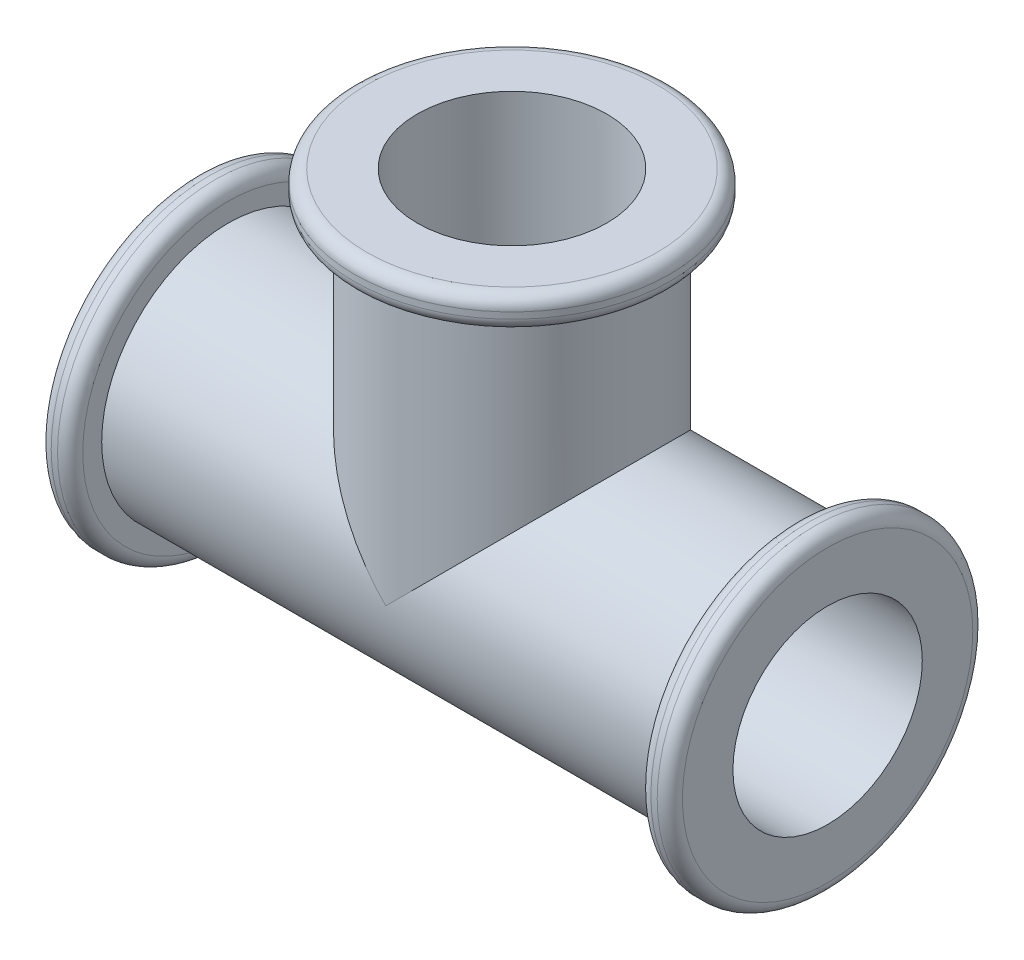
ISO-10303-21;
HEADER;
FILE_DESCRIPTION(('STEP AP214'),'2;1');
FILE_NAME('part.step','',(''),(''),'','','');
FILE_SCHEMA(('AUTOMOTIVE_DESIGN { 1 0 10303 214 1 1 1 1 }'));
ENDSEC;
DATA;
#1=APPLICATION_CONTEXT('core data for automotive mechanical design processes');
#2=APPLICATION_PROTOCOL_DEFINITION('international standard','automotive_design',2000,#1);
#3=PRODUCT_CONTEXT('',#1,'mechanical');
#4=PRODUCT('Part','Part','',(#3));
#5=PRODUCT_RELATED_PRODUCT_CATEGORY('part','',(#4));
#6=PRODUCT_DEFINITION_FORMATION('','',#4);
#7=PRODUCT_DEFINITION_CONTEXT('part definition',#1,'design');
#8=PRODUCT_DEFINITION('design','',#6,#7);
#9=PRODUCT_DEFINITION_SHAPE('','',#8);
#10=(LENGTH_UNIT() NAMED_UNIT(*) SI_UNIT(.MILLI.,.METRE.));
#11=(NAMED_UNIT(*) PLANE_ANGLE_UNIT() SI_UNIT($,.RADIAN.));
#12=(NAMED_UNIT(*) SI_UNIT($,.STERADIAN.) SOLID_ANGLE_UNIT());
#13=UNCERTAINTY_MEASURE_WITH_UNIT(LENGTH_MEASURE(1.E-05),#10,'distance_accuracy_value','');
#14=(GEOMETRIC_REPRESENTATION_CONTEXT(3) GLOBAL_UNCERTAINTY_ASSIGNED_CONTEXT((#13)) GLOBAL_UNIT_ASSIGNED_CONTEXT((#10,
#11,#12)) REPRESENTATION_CONTEXT('',''));
#15=CARTESIAN_POINT('',(0.,0.,0.));
#16=DIRECTION('',(0.,0.,1.));
#17=DIRECTION('',(1.,0.,0.));
#18=AXIS2_PLACEMENT_3D('',#15,#16,#17);
#19=CARTESIAN_POINT('',(0.,-12.502,0.));
#20=DIRECTION('',(0.,1.,0.));
#21=DIRECTION('',(0.,0.,1.));
#22=AXIS2_PLACEMENT_3D('',#19,#20,#21);
#23=CYLINDRICAL_SURFACE('',#22,10.);
#24=CARTESIAN_POINT('',(0.,0.,0.));
#25=DIRECTION('',(0.707106781186547,0.707106781186547,0.));
#26=DIRECTION('',(-0.707106781186547,0.707106781186547,0.));
#27=AXIS2_PLACEMENT_3D('',#24,#25,#26);
#28=ELLIPSE('',#27,14.1421356237309,10.);
#29=CARTESIAN_POINT('',(0.,0.,-10.));
#30=VERTEX_POINT('',#29);
#31=CARTESIAN_POINT('',(0.,0.,10.));
#32=VERTEX_POINT('',#31);
#33=EDGE_CURVE('E68',#30,#32,#28,.T.);
#34=ORIENTED_EDGE('',*,*,#33,.T.);
#35=CARTESIAN_POINT('',(0.,0.,0.));
#36=DIRECTION('',(-0.707106781186547,0.707106781186547,0.));
#37=DIRECTION('',(0.707106781186547,0.707106781186547,0.));
#38=AXIS2_PLACEMENT_3D('',#35,#36,#37);
#39=ELLIPSE('',#38,14.1421356237309,10.);
#40=EDGE_CURVE('E66',#32,#30,#39,.T.);
#41=ORIENTED_EDGE('',*,*,#40,.T.);
#42=EDGE_LOOP('',(#34,#41));
#43=FACE_BOUND('',#42,.T.);
#44=CARTESIAN_POINT('',(0.,22.5,0.));
#45=DIRECTION('',(0.,1.,0.));
#46=DIRECTION('',(0.,0.,1.));
#47=AXIS2_PLACEMENT_3D('',#44,#45,#46);
#48=CIRCLE('',#47,10.);
#49=CARTESIAN_POINT('',(0.,22.5,10.));
#50=VERTEX_POINT('',#49);
#51=EDGE_CURVE('E77',#50,#50,#48,.F.);
#52=ORIENTED_EDGE('',*,*,#51,.T.);
#53=EDGE_LOOP('',(#52));
#54=FACE_BOUND('',#53,.T.);
#55=ADVANCED_FACE('F51',(#43,#54),#23,.T.);
#56=CARTESIAN_POINT('',(25.,0.,0.));
#57=DIRECTION('',(-1.,0.,0.));
#58=DIRECTION('',(0.,0.,1.));
#59=AXIS2_PLACEMENT_3D('',#56,#57,#58);
#60=CYLINDRICAL_SURFACE('',#59,10.);
#61=ORIENTED_EDGE('',*,*,#33,.F.);
#62=ORIENTED_EDGE('',*,*,#40,.F.);
#63=EDGE_LOOP('',(#61,#62));
#64=FACE_BOUND('',#63,.T.);
#65=CARTESIAN_POINT('',(22.5,0.,0.));
#66=DIRECTION('',(1.,0.,0.));
#67=DIRECTION('',(0.,0.,-1.));
#68=AXIS2_PLACEMENT_3D('',#65,#66,#67);
#69=CIRCLE('',#68,10.);
#70=CARTESIAN_POINT('',(22.5,0.,-10.));
#71=VERTEX_POINT('',#70);
#72=EDGE_CURVE('E88',#71,#71,#69,.T.);
#73=ORIENTED_EDGE('',*,*,#72,.F.);
#74=EDGE_LOOP('',(#73));
#75=FACE_BOUND('',#74,.T.);
#76=CARTESIAN_POINT('',(-22.5,0.,0.));
#77=DIRECTION('',(-1.,0.,0.));
#78=DIRECTION('',(0.,0.,1.));
#79=AXIS2_PLACEMENT_3D('',#76,#77,#78);
#80=CIRCLE('',#79,10.);
#81=CARTESIAN_POINT('',(-22.5,0.,10.));
#82=VERTEX_POINT('',#81);
#83=EDGE_CURVE('E89',#82,#82,#80,.T.);
#84=ORIENTED_EDGE('',*,*,#83,.F.);
#85=EDGE_LOOP('',(#84));
#86=FACE_BOUND('',#85,.T.);
#87=ADVANCED_FACE('F74',(#64,#75,#86),#60,.T.);
#88=CARTESIAN_POINT('',(22.5,0.,0.));
#89=DIRECTION('',(1.,0.,0.));
#90=DIRECTION('',(0.,0.,-1.));
#91=AXIS2_PLACEMENT_3D('',#88,#89,#90);
#92=CYLINDRICAL_SURFACE('',#91,12.5);
#93=CARTESIAN_POINT('',(23.5,0.,0.));
#94=DIRECTION('',(1.,0.,0.));
#95=DIRECTION('',(0.,0.,-1.));
#96=AXIS2_PLACEMENT_3D('',#93,#94,#95);
#97=CIRCLE('',#96,12.5);
#98=CARTESIAN_POINT('',(23.5,0.,-12.5));
#99=VERTEX_POINT('',#98);
#100=EDGE_CURVE('E213',#99,#99,#97,.T.);
#101=ORIENTED_EDGE('',*,*,#100,.T.);
#102=EDGE_LOOP('',(#101));
#103=FACE_BOUND('',#102,.T.);
#104=CARTESIAN_POINT('',(24.,0.,0.));
#105=DIRECTION('',(1.,0.,0.));
#106=DIRECTION('',(0.,0.,-1.));
#107=AXIS2_PLACEMENT_3D('',#104,#105,#106);
#108=CIRCLE('',#107,12.5);
#109=CARTESIAN_POINT('',(24.,0.,-12.5));
#110=VERTEX_POINT('',#109);
#111=EDGE_CURVE('E209',#110,#110,#108,.F.);
#112=ORIENTED_EDGE('',*,*,#111,.T.);
#113=EDGE_LOOP('',(#112));
#114=FACE_BOUND('',#113,.T.);
#115=ADVANCED_FACE('F132',(#103,#114),#92,.T.);
#116=CARTESIAN_POINT('',(22.5,0.,0.));
#117=DIRECTION('',(1.,0.,0.));
#118=DIRECTION('',(0.,0.,-1.));
#119=AXIS2_PLACEMENT_3D('',#116,#117,#118);
#120=PLANE('',#119);
#121=CARTESIAN_POINT('',(22.5,0.,0.));
#122=DIRECTION('',(1.,0.,0.));
#123=DIRECTION('',(0.,0.,-1.));
#124=AXIS2_PLACEMENT_3D('',#121,#122,#123);
#125=CIRCLE('',#124,11.5);
#126=CARTESIAN_POINT('',(22.5,0.,-11.5));
#127=VERTEX_POINT('',#126);
#128=EDGE_CURVE('E217',#127,#127,#125,.F.);
#129=ORIENTED_EDGE('',*,*,#128,.T.);
#130=EDGE_LOOP('',(#129));
#131=FACE_BOUND('',#130,.T.);
#132=ORIENTED_EDGE('',*,*,#72,.T.);
#133=EDGE_LOOP('',(#132));
#134=FACE_BOUND('',#133,.T.);
#135=ADVANCED_FACE('F129',(#131,#134),#120,.F.);
#136=CARTESIAN_POINT('',(25.,0.,0.));
#137=DIRECTION('',(1.,0.,0.));
#138=DIRECTION('',(0.,0.,-1.));
#139=AXIS2_PLACEMENT_3D('',#136,#137,#138);
#140=PLANE('',#139);
#141=CARTESIAN_POINT('',(25.,0.,0.));
#142=DIRECTION('',(1.,0.,0.));
#143=DIRECTION('',(0.,0.,-1.));
#144=AXIS2_PLACEMENT_3D('',#141,#142,#143);
#145=CIRCLE('',#144,11.5);
#146=CARTESIAN_POINT('',(25.,0.,-11.5));
#147=VERTEX_POINT('',#146);
#148=EDGE_CURVE('E60',#147,#147,#145,.T.);
#149=ORIENTED_EDGE('',*,*,#148,.T.);
#150=EDGE_LOOP('',(#149));
#151=FACE_BOUND('',#150,.T.);
#152=CARTESIAN_POINT('',(25.,0.,0.));
#153=DIRECTION('',(1.,0.,0.));
#154=DIRECTION('',(0.,0.,-1.));
#155=AXIS2_PLACEMENT_3D('',#152,#153,#154);
#156=CIRCLE('',#155,7.50000000000001);
#157=CARTESIAN_POINT('',(25.,0.,-7.50000000000001));
#158=VERTEX_POINT('',#157);
#159=EDGE_CURVE('E385',#158,#158,#156,.T.);
#160=ORIENTED_EDGE('',*,*,#159,.F.);
#161=EDGE_LOOP('',(#160));
#162=FACE_BOUND('',#161,.T.);
#163=ADVANCED_FACE('F127',(#151,#162),#140,.T.);
#164=CARTESIAN_POINT('',(-22.5,0.,0.));
#165=DIRECTION('',(-1.,0.,0.));
#166=DIRECTION('',(0.,0.,1.));
#167=AXIS2_PLACEMENT_3D('',#164,#165,#166);
#168=CYLINDRICAL_SURFACE('',#167,12.5);
#169=CARTESIAN_POINT('',(-24.,0.,0.));
#170=DIRECTION('',(1.,0.,0.));
#171=DIRECTION('',(0.,0.,-1.));
#172=AXIS2_PLACEMENT_3D('',#169,#170,#171);
#173=CIRCLE('',#172,12.5);
#174=CARTESIAN_POINT('',(-24.,0.,-12.5));
#175=VERTEX_POINT('',#174);
#176=EDGE_CURVE('E198',#175,#175,#173,.T.);
#177=ORIENTED_EDGE('',*,*,#176,.T.);
#178=EDGE_LOOP('',(#177));
#179=FACE_BOUND('',#178,.T.);
#180=CARTESIAN_POINT('',(-23.5,0.,0.));
#181=DIRECTION('',(-1.,0.,0.));
#182=DIRECTION('',(0.,0.,1.));
#183=AXIS2_PLACEMENT_3D('',#180,#181,#182);
#184=CIRCLE('',#183,12.5);
#185=CARTESIAN_POINT('',(-23.5,0.,12.5));
#186=VERTEX_POINT('',#185);
#187=EDGE_CURVE('E192',#186,#186,#184,.T.);
#188=ORIENTED_EDGE('',*,*,#187,.T.);
#189=EDGE_LOOP('',(#188));
#190=FACE_BOUND('',#189,.T.);
#191=ADVANCED_FACE('F123',(#179,#190),#168,.T.);
#192=CARTESIAN_POINT('',(-22.5,0.,0.));
#193=DIRECTION('',(-1.,0.,0.));
#194=DIRECTION('',(0.,0.,-1.));
#195=AXIS2_PLACEMENT_3D('',#192,#193,#194);
#196=PLANE('',#195);
#197=CARTESIAN_POINT('',(-22.5,0.,0.));
#198=DIRECTION('',(-1.,0.,0.));
#199=DIRECTION('',(0.,0.,1.));
#200=AXIS2_PLACEMENT_3D('',#197,#198,#199);
#201=CIRCLE('',#200,11.5);
#202=CARTESIAN_POINT('',(-22.5,0.,11.5));
#203=VERTEX_POINT('',#202);
#204=EDGE_CURVE('E205',#203,#203,#201,.F.);
#205=ORIENTED_EDGE('',*,*,#204,.T.);
#206=EDGE_LOOP('',(#205));
#207=FACE_BOUND('',#206,.T.);
#208=ORIENTED_EDGE('',*,*,#83,.T.);
#209=EDGE_LOOP('',(#208));
#210=FACE_BOUND('',#209,.T.);
#211=ADVANCED_FACE('F119',(#207,#210),#196,.F.);
#212=CARTESIAN_POINT('',(-25.,0.,0.));
#213=DIRECTION('',(1.,0.,0.));
#214=DIRECTION('',(0.,0.,-1.));
#215=AXIS2_PLACEMENT_3D('',#212,#213,#214);
#216=PLANE('',#215);
#217=CARTESIAN_POINT('',(-25.,0.,0.));
#218=DIRECTION('',(1.,0.,0.));
#219=DIRECTION('',(0.,0.,-1.));
#220=AXIS2_PLACEMENT_3D('',#217,#218,#219);
#221=CIRCLE('',#220,11.5);
#222=CARTESIAN_POINT('',(-25.,0.,-11.5));
#223=VERTEX_POINT('',#222);
#224=EDGE_CURVE('E202',#223,#223,#221,.F.);
#225=ORIENTED_EDGE('',*,*,#224,.T.);
#226=EDGE_LOOP('',(#225));
#227=FACE_BOUND('',#226,.T.);
#228=CARTESIAN_POINT('',(-25.,0.,0.));
#229=DIRECTION('',(1.,0.,0.));
#230=DIRECTION('',(0.,0.,-1.));
#231=AXIS2_PLACEMENT_3D('',#228,#229,#230);
#232=CIRCLE('',#231,7.50000000000001);
#233=CARTESIAN_POINT('',(-25.,0.,-7.50000000000001));
#234=VERTEX_POINT('',#233);
#235=EDGE_CURVE('E81',#234,#234,#232,.T.);
#236=ORIENTED_EDGE('',*,*,#235,.T.);
#237=EDGE_LOOP('',(#236));
#238=FACE_BOUND('',#237,.T.);
#239=ADVANCED_FACE('F122',(#227,#238),#216,.F.);
#240=CARTESIAN_POINT('',(0.,22.5,0.));
#241=DIRECTION('',(0.,1.,0.));
#242=DIRECTION('',(0.,0.,1.));
#243=AXIS2_PLACEMENT_3D('',#240,#241,#242);
#244=CYLINDRICAL_SURFACE('',#243,12.5);
#245=CARTESIAN_POINT('',(0.,24.,0.));
#246=DIRECTION('',(0.,1.,0.));
#247=DIRECTION('',(0.,0.,1.));
#248=AXIS2_PLACEMENT_3D('',#245,#246,#247);
#249=CIRCLE('',#248,12.5);
#250=CARTESIAN_POINT('',(0.,24.,12.5));
#251=VERTEX_POINT('',#250);
#252=EDGE_CURVE('E187',#251,#251,#249,.F.);
#253=ORIENTED_EDGE('',*,*,#252,.T.);
#254=EDGE_LOOP('',(#253));
#255=FACE_BOUND('',#254,.T.);
#256=CARTESIAN_POINT('',(0.,23.5,0.));
#257=DIRECTION('',(0.,1.,0.));
#258=DIRECTION('',(0.,0.,1.));
#259=AXIS2_PLACEMENT_3D('',#256,#257,#258);
#260=CIRCLE('',#259,12.5);
#261=CARTESIAN_POINT('',(0.,23.5,12.5));
#262=VERTEX_POINT('',#261);
#263=EDGE_CURVE('E184',#262,#262,#260,.T.);
#264=ORIENTED_EDGE('',*,*,#263,.T.);
#265=EDGE_LOOP('',(#264));
#266=FACE_BOUND('',#265,.T.);
#267=ADVANCED_FACE('F145',(#255,#266),#244,.T.);
#268=CARTESIAN_POINT('',(0.,22.5,0.));
#269=DIRECTION('',(0.,1.,0.));
#270=DIRECTION('',(0.,0.,1.));
#271=AXIS2_PLACEMENT_3D('',#268,#269,#270);
#272=PLANE('',#271);
#273=CARTESIAN_POINT('',(0.,22.5,0.));
#274=DIRECTION('',(0.,1.,0.));
#275=DIRECTION('',(0.,0.,1.));
#276=AXIS2_PLACEMENT_3D('',#273,#274,#275);
#277=CIRCLE('',#276,11.5);
#278=CARTESIAN_POINT('',(0.,22.5,11.5));
#279=VERTEX_POINT('',#278);
#280=EDGE_CURVE('E12',#279,#279,#277,.F.);
#281=ORIENTED_EDGE('',*,*,#280,.T.);
#282=EDGE_LOOP('',(#281));
#283=FACE_BOUND('',#282,.T.);
#284=ORIENTED_EDGE('',*,*,#51,.F.);
#285=EDGE_LOOP('',(#284));
#286=FACE_BOUND('',#285,.T.);
#287=ADVANCED_FACE('F150',(#283,#286),#272,.F.);
#288=CARTESIAN_POINT('',(0.,6.61437827766147,7.5));
#289=CARTESIAN_POINT('',(-0.17504274505637,6.6143819762977,7.49999838387404));
#290=CARTESIAN_POINT('',(-0.350119145702295,6.6213667833604,7.4938544531901));
#291=CARTESIAN_POINT('',(-0.698370859496996,6.64887553786825,7.46945630098661));
#292=CARTESIAN_POINT('',(-0.871545518764412,6.66940400249785,7.45119803899091));
#293=CARTESIAN_POINT('',(-1.21468926880288,6.72284656903216,7.40301431271971));
#294=CARTESIAN_POINT('',(-1.38465041251844,6.75578799539214,7.37306310366495));
#295=CARTESIAN_POINT('',(-1.71986277717137,6.8323686910377,7.30215402879712));
#296=CARTESIAN_POINT('',(-1.88511109316884,6.87601440577396,7.26118953003702));
#297=CARTESIAN_POINT('',(-2.20771561850324,6.97141228827306,7.16963772461485));
#298=CARTESIAN_POINT('',(-2.36515113857652,7.02303888080965,7.11919724072745));
#299=CARTESIAN_POINT('',(-2.67419293107733,7.13305481255116,7.00896652342575));
#300=CARTESIAN_POINT('',(-2.82579985213641,7.19144339633406,6.94917733414979));
#301=CARTESIAN_POINT('',(-3.27160873914532,7.37426489006267,6.75658060252613));
#302=CARTESIAN_POINT('',(-3.5570438840726,7.50643092066623,6.61047289700966));
#303=CARTESIAN_POINT('',(-3.99541081726528,7.72612312151328,6.35008921903902));
#304=CARTESIAN_POINT('',(-4.15615316575257,7.8106651724496,6.24603009576815));
#305=CARTESIAN_POINT('',(-4.46871903668722,7.98137144438257,6.02636084854274));
#306=CARTESIAN_POINT('',(-4.62054182383562,8.06753579834549,5.91074977439962));
#307=CARTESIAN_POINT('',(-4.91520104423277,8.23983652349764,5.66809334754194));
#308=CARTESIAN_POINT('',(-5.05802418508795,8.32597267462924,5.54103172535059));
#309=CARTESIAN_POINT('',(-5.33408445927277,8.49650996249822,5.27581060151741));
#310=CARTESIAN_POINT('',(-5.46732155596776,8.58091109260406,5.1376510574673));
#311=CARTESIAN_POINT('',(-5.7499246921732,8.76343118826713,4.8210103497897));
#312=CARTESIAN_POINT('',(-5.89701404634829,8.86082412343817,4.64006256697592));
#313=CARTESIAN_POINT('',(-6.17528183227035,9.04840053279327,4.26272756958657));
#314=CARTESIAN_POINT('',(-6.3064566859225,9.13858238414423,4.06633689924784));
#315=CARTESIAN_POINT('',(-6.55103109308801,9.30904597144164,3.65927040592032));
#316=CARTESIAN_POINT('',(-6.66446411643237,9.389346286259,3.44862258189058));
#317=CARTESIAN_POINT('',(-6.87196979125072,9.53775182569571,3.01395872397105));
#318=CARTESIAN_POINT('',(-6.9660526843648,9.60586349902812,2.78994984323821));
#319=CARTESIAN_POINT('',(-7.10776033708898,9.70920590550307,2.39977112189464));
#320=CARTESIAN_POINT('',(-7.16083762462404,9.7481569422498,2.23654263418172));
#321=CARTESIAN_POINT('',(-7.25599960853253,9.81827338648172,1.90529321507479));
#322=CARTESIAN_POINT('',(-7.2980869368163,9.84944065796967,1.73727344182394));
#323=CARTESIAN_POINT('',(-7.37068804314675,9.90335558510536,1.39753765355225));
#324=CARTESIAN_POINT('',(-7.4012095412221,9.92610885673368,1.22582418520902));
#325=CARTESIAN_POINT('',(-7.4502746855015,9.96274691067039,0.879743734183585));
#326=CARTESIAN_POINT('',(-7.46881790234558,9.97663137507731,0.705376656612369));
#327=CARTESIAN_POINT('',(-7.49366784467255,9.9952483493686,0.354821662174929));
#328=CARTESIAN_POINT('',(-7.49994237770958,9.99995678167227,0.178630171226914));
#329=CARTESIAN_POINT('',(-7.50005683113607,10.000042624962,-0.173758351306047));
#330=CARTESIAN_POINT('',(-7.49389680073092,9.99542007287206,-0.349955382866308));
#331=CARTESIAN_POINT('',(-7.46923905931901,9.97694670651412,-0.701027604628014));
#332=CARTESIAN_POINT('',(-7.45073890946883,9.96309406805562,-0.875902526623198));
#333=CARTESIAN_POINT('',(-7.4016891825028,9.92646651600951,-1.22299713100226));
#334=CARTESIAN_POINT('',(-7.37113968535831,9.90369166163854,-1.39521683100093));
#335=CARTESIAN_POINT('',(-7.2996954090771,9.85063449039492,-1.72994463123949));
#336=CARTESIAN_POINT('',(-7.259194717014,9.82063888168686,-1.89258265463912));
#337=CARTESIAN_POINT('',(-7.16789010348176,9.7533432482617,-2.21341583625951));
#338=CARTESIAN_POINT('',(-7.11708259473587,9.71604068052106,-2.37160942571489));
#339=CARTESIAN_POINT('',(-6.95006274717155,9.59413977438204,-2.83823794303704));
#340=CARTESIAN_POINT('',(-6.81920036438611,9.49950846801055,-3.13896269049413));
#341=CARTESIAN_POINT('',(-6.50734387047821,9.27804864379447,-3.74612986545195));
#342=CARTESIAN_POINT('',(-6.3224558655491,9.14884335766367,-4.0496657186402));
#343=CARTESIAN_POINT('',(-5.91631511751204,8.87301878295385,-4.62284746725909));
#344=CARTESIAN_POINT('',(-5.69503138536139,8.72638468442634,-4.89246413400518));
#345=CARTESIAN_POINT('',(-5.31581411389265,8.485042738548,-5.29480881247806));
#346=CARTESIAN_POINT('',(-5.16809085297808,8.39310925041175,-5.43905294132654));
#347=CARTESIAN_POINT('',(-4.86166142579991,8.20797296629043,-5.71460427162252));
#348=CARTESIAN_POINT('',(-4.70295314530712,8.11476992874987,-5.84590897083322));
#349=CARTESIAN_POINT('',(-4.37489703005722,7.92914991013118,-6.09530688932278));
#350=CARTESIAN_POINT('',(-4.20554361298499,7.83673337082412,-6.21339308501906));
#351=CARTESIAN_POINT('',(-3.85647449499815,7.65507530287246,-6.43587029402998));
#352=CARTESIAN_POINT('',(-3.67676112193589,7.56583306820197,-6.54026436679214));
#353=CARTESIAN_POINT('',(-3.3435305255638,7.41026277562445,-6.7155722654236));
#354=CARTESIAN_POINT('',(-3.1918373125528,7.34288681688719,-6.78902852483033));
#355=CARTESIAN_POINT('',(-2.8818286600929,7.21353507700448,-6.92631258115993));
#356=CARTESIAN_POINT('',(-2.72351115335445,7.1515610005483,-6.99013734325369));
#357=CARTESIAN_POINT('',(-2.40078106938068,7.03499498355601,-7.10743795595147));
#358=CARTESIAN_POINT('',(-2.23637992914152,6.98039000655185,-7.16093215631046));
#359=CARTESIAN_POINT('',(-1.90173398337719,6.88048971673614,-7.25697383906694));
#360=CARTESIAN_POINT('',(-1.73149346253768,6.83518774138737,-7.29952916110583));
#361=CARTESIAN_POINT('',(-1.4201065752548,6.76376361800342,-7.36568941013316));
#362=CARTESIAN_POINT('',(-1.27986564928429,6.73562014480373,-7.39137773468902));
#363=CARTESIAN_POINT('',(-0.996812114330297,6.68761574057221,-7.43484020430898));
#364=CARTESIAN_POINT('',(-0.854000818986896,6.66775069741102,-7.45261827891484));
#365=CARTESIAN_POINT('',(-0.566747802379881,6.63708025293432,-7.47994591403064));
#366=CARTESIAN_POINT('',(-0.422307669954232,6.62626668641683,-7.48950289088611));
#367=CARTESIAN_POINT('',(-0.132710912533417,6.61412778066668,-7.50022540461936));
#368=CARTESIAN_POINT('',(0.012445719814645,6.61280253900894,-7.50139085520134));
#369=CARTESIAN_POINT('',(0.302399458554398,6.61970015257382,-7.49530453133557));
#370=CARTESIAN_POINT('',(0.447196430889058,6.62792615054571,-7.4880499863645));
#371=CARTESIAN_POINT('',(0.735304347701751,6.65357632859433,-7.46526710078138));
#372=CARTESIAN_POINT('',(0.878615290476944,6.67100051921007,-7.44973875068944));
#373=CARTESIAN_POINT('',(1.16300453984837,6.71437252311565,-7.41067135494668));
#374=CARTESIAN_POINT('',(1.30407985269954,6.74033089503036,-7.38712238475188));
#375=CARTESIAN_POINT('',(1.58317138197441,6.79983969759906,-7.33238101466956));
#376=CARTESIAN_POINT('',(1.72118576102563,6.83339455960175,-7.30118415256481));
#377=CARTESIAN_POINT('',(2.04453327820463,6.92081343095282,-7.21853070164236));
#378=CARTESIAN_POINT('',(2.22826531808666,6.97758010532759,-7.16386030544521));
#379=CARTESIAN_POINT('',(2.58816900651376,7.10070244483857,-7.04184138194053));
#380=CARTESIAN_POINT('',(2.76433695078966,7.16706274021179,-6.97448672796228));
#381=CARTESIAN_POINT('',(3.10897695466769,7.30690755766541,-6.82783857722431));
#382=CARTESIAN_POINT('',(3.27743828245919,7.38040159461201,-6.74852905513665));
#383=CARTESIAN_POINT('',(3.60628224855554,7.53219738599037,-6.57867589007165));
#384=CARTESIAN_POINT('',(3.76666561469197,7.61049870586594,-6.48813326176224));
#385=CARTESIAN_POINT('',(4.08484159575621,7.77280857721973,-6.29286343156943));
#386=CARTESIAN_POINT('',(4.24234264199053,7.85692102684046,-6.1877481912395));
#387=CARTESIAN_POINT('',(4.54857908441787,8.02641315727647,-5.96625095327432));
#388=CARTESIAN_POINT('',(4.69731144936841,8.11179326368698,-5.8498650958194));
#389=CARTESIAN_POINT('',(4.9857693867153,8.28217070112482,-5.60604802897366));
#390=CARTESIAN_POINT('',(5.12549204526758,8.36716790013076,-5.47861327717322));
#391=CARTESIAN_POINT('',(5.3954907605958,8.53523072259393,-5.2129217295144));
#392=CARTESIAN_POINT('',(5.52576672233518,8.61829632661303,-5.07466482481105));
#393=CARTESIAN_POINT('',(5.80374649790019,8.79886280965527,-4.75609627857785));
#394=CARTESIAN_POINT('',(5.9490352358762,8.89555017880777,-4.57319795109074));
#395=CARTESIAN_POINT('',(6.22351369133032,9.08140583135808,-4.19202039254));
#396=CARTESIAN_POINT('',(6.35269975440163,9.17057240647706,-3.99373768658795));
#397=CARTESIAN_POINT('',(6.59309973527558,9.33871511072048,-3.58295524329398));
#398=CARTESIAN_POINT('',(6.70434399040802,9.41770839502805,-3.37048038218725));
#399=CARTESIAN_POINT('',(6.90721459476481,9.56319061215452,-2.93233430317765));
#400=CARTESIAN_POINT('',(6.99885153168538,9.62968629114609,-2.7066702914896));
#401=CARTESIAN_POINT('',(7.13594683127491,9.72986513620538,-2.31458682145055));
#402=CARTESIAN_POINT('',(7.18696832201431,9.76737290150481,-2.15106438801798));
#403=CARTESIAN_POINT('',(7.27799769396799,9.83454643934873,-1.81942149738114));
#404=CARTESIAN_POINT('',(7.31800820540457,9.8642140846164,-1.6513021488213));
#405=CARTESIAN_POINT('',(7.38645709360363,9.91510086141253,-1.31158500513156));
#406=CARTESIAN_POINT('',(7.41490355131715,9.93632589240866,-1.13998972731271));
#407=CARTESIAN_POINT('',(7.45984888136917,9.96991081706726,-0.794368064329089));
#408=CARTESIAN_POINT('',(7.47634730729937,9.98227037949355,-0.620341588576282));
#409=CARTESIAN_POINT('',(7.49716192377631,9.99786922691846,-0.270737236865624));
#410=CARTESIAN_POINT('',(7.50144922902552,10.0010868867835,-0.095156666283223));
#411=CARTESIAN_POINT('',(7.49769057486672,9.99826797422904,0.255796459899253));
#412=CARTESIAN_POINT('',(7.4896446687018,9.99223144176046,0.431169016394064));
#413=CARTESIAN_POINT('',(7.46134480780408,9.97103698632919,0.780405860087463));
#414=CARTESIAN_POINT('',(7.44108809976061,9.95587700619856,0.954269798148902));
#415=CARTESIAN_POINT('',(7.38867771478753,9.91676635381665,1.29918219505268));
#416=CARTESIAN_POINT('',(7.35652407050672,9.89281570568963,1.47023066162018));
#417=CARTESIAN_POINT('',(7.28189307709132,9.83744673781723,1.80341707766246));
#418=CARTESIAN_POINT('',(7.23974634119007,9.8062681638195,1.96566921370883));
#419=CARTESIAN_POINT('',(7.14520309294347,9.7366786515487,2.28559292852834));
#420=CARTESIAN_POINT('',(7.09280300352853,9.69826518942856,2.44326288661389));
#421=CARTESIAN_POINT('',(6.92110225774481,9.57316299030428,2.90814334154297));
#422=CARTESIAN_POINT('',(6.78724605295606,9.47657095067025,3.20746548927604));
#423=CARTESIAN_POINT('',(6.46860168175561,9.25087814998407,3.8127837237771));
#424=CARTESIAN_POINT('',(6.27976164738311,9.11933431178644,4.11569486640102));
#425=CARTESIAN_POINT('',(5.86565147799067,8.83925861197747,4.68708538623881));
#426=CARTESIAN_POINT('',(5.64034786026238,8.69071117385267,4.95553270683283));
#427=CARTESIAN_POINT('',(5.25447653158745,8.44671829342253,5.35573297787662));
#428=CARTESIAN_POINT('',(5.10414606638606,8.35384690618711,5.49915593102941));
#429=CARTESIAN_POINT('',(4.79241369482712,8.1671063077942,5.77284943140309));
#430=CARTESIAN_POINT('',(4.63100953564152,8.07323689690108,5.90311728895228));
#431=CARTESIAN_POINT('',(4.29746571429963,7.8866399911287,6.15019469285746));
#432=CARTESIAN_POINT('',(4.12532129703785,7.79391302412087,6.26699821194905));
#433=CARTESIAN_POINT('',(3.77054927179511,7.61208490038275,6.48663766052406));
#434=CARTESIAN_POINT('',(3.58792438907829,7.5229828112717,6.58947719789702));
#435=CARTESIAN_POINT('',(3.25286478435908,7.36980342890909,6.75989283434651));
#436=CARTESIAN_POINT('',(3.10243084431296,7.30447828912286,6.83028750809664));
#437=CARTESIAN_POINT('',(2.79519765738826,7.17937554694085,6.9616658727386));
#438=CARTESIAN_POINT('',(2.63839693693284,7.11959923945138,7.02264736910911));
#439=CARTESIAN_POINT('',(2.31902463270295,7.00753877029719,7.1344699800963));
#440=CARTESIAN_POINT('',(2.15646715573252,6.95523768808627,7.18533410159404));
#441=CARTESIAN_POINT('',(1.82582318644918,6.85992197126499,7.2763865291595));
#442=CARTESIAN_POINT('',(1.65773910143077,6.81690335354225,7.31657941597485));
#443=CARTESIAN_POINT('',(1.24611764988477,6.72665035308058,7.39982855789616));
#444=CARTESIAN_POINT('',(1.00008621921669,6.685011615971,7.4372125818488));
#445=CARTESIAN_POINT('',(0.627109028744517,6.64288211241111,7.47478587010325));
#446=CARTESIAN_POINT('',(0.502120598471653,6.63222701531837,7.48422651957545));
#447=CARTESIAN_POINT('',(0.251427162606856,6.61797427482255,7.49683371584342));
#448=CARTESIAN_POINT('',(0.125722262175374,6.61437562116226,7.50000116076226));
#449=CARTESIAN_POINT('',(0.,6.61437827766147,7.5));
#450=B_SPLINE_CURVE_WITH_KNOTS('',3,(#288,#289,#290,#291,#292,#293,#294,#295,#296,#297,#298,
#299,#300,#301,#302,#303,#304,#305,#306,#307,#308,#309,#310,#311,#312,#313,#314,#315,#316,#317,
#318,#319,#320,#321,#322,#323,#324,#325,#326,#327,#328,#329,#330,#331,#332,#333,#334,#335,#336,
#337,#338,#339,#340,#341,#342,#343,#344,#345,#346,#347,#348,#349,#350,#351,#352,#353,#354,#355,
#356,#357,#358,#359,#360,#361,#362,#363,#364,#365,#366,#367,#368,#369,#370,#371,#372,#373,#374,
#375,#376,#377,#378,#379,#380,#381,#382,#383,#384,#385,#386,#387,#388,#389,#390,#391,#392,#393,
#394,#395,#396,#397,#398,#399,#400,#401,#402,#403,#404,#405,#406,#407,#408,#409,#410,#411,#412,
#413,#414,#415,#416,#417,#418,#419,#420,#421,#422,#423,#424,#425,#426,#427,#428,#429,#430,#431,
#432,#433,#434,#435,#436,#437,#438,#439,#440,#441,#442,#443,#444,#445,#446,#447,#448,#449),
.UNSPECIFIED.,.T.,.F.,(4,2,2,2,2,2,2,2,2,2,2,2,2,2,2,2,2,2,2,2,2,2,2,2,2,2,2,2,2,2,2,2,2,2,2,2,
2,2,2,2,2,2,2,2,2,2,2,2,2,2,2,2,2,2,2,2,2,2,2,2,2,2,2,2,2,2,2,2,2,2,2,2,2,2,2,2,2,2,2,2,4),(0.,
0.52494665430854,1.05006848141856,1.57635306837582,2.1029553322816,2.62198622685236,
3.14095919324642,4.17811218850752,4.80566508397348,5.43326964042964,6.061780426393,
6.69029361418683,7.44738762703935,8.20465154491873,8.96046919626114,9.71588577295534,
10.2433789495487,10.7707456843026,11.2977597865321,11.8247927784671,12.3532068340179,
12.8816187985613,13.4101352269263,13.9386481475935,14.448892861373,14.9593154709263,
15.9794159816072,17.1099698820185,18.2414914205569,18.9189650138306,19.5965693614304,
20.2745320584566,20.9523430085371,21.4964710416301,22.0407701699222,22.5840934051783,
23.1270261606961,23.5625720536543,23.9979013400772,24.4328374979326,24.8677781285273,
25.3028619129807,25.7379461959414,26.1735708106619,26.609450201141,27.2082971358611,
27.8074340672286,28.4073813950994,29.0072745701219,29.6283553138709,30.2496495148833,
30.8711436522056,31.4926440410755,32.2499956478533,33.0075188193678,33.7637473732032,
34.5195665371228,35.0451096014309,35.57052701867,36.0955766408918,36.6206458792658,
37.1469561368486,37.6732641223298,38.1996908249707,38.7261160829478,39.2370944402893,
39.7482513806143,40.7698210149854,41.9071133704993,43.045456033251,43.7276445027794,
44.4099721703686,45.0926041030805,45.7750593264447,46.3100858652191,46.8452369485077,
47.3791568263482,47.9128471411508,48.6669364564278,49.044026816004,49.4210631843482),.UNSPECIFIED.);
#451=CARTESIAN_POINT('',(0.,6.61437827766147,7.5));
#452=VERTEX_POINT('',#451);
#453=EDGE_CURVE('E93',#452,#452,#450,.T.);
#454=ORIENTED_EDGE('',*,*,#453,.F.);
#455=EDGE_LOOP('',(#454));
#456=FACE_BOUND('',#455,.T.);
#457=ADVANCED_FACE('F116',(#456),#60,.T.);
#458=CARTESIAN_POINT('',(0.,-12.502,0.));
#459=DIRECTION('',(0.,1.,0.));
#460=DIRECTION('',(0.,0.,1.));
#461=AXIS2_PLACEMENT_3D('',#458,#459,#460);
#462=CYLINDRICAL_SURFACE('',#461,7.5);
#463=CARTESIAN_POINT('',(0.,25.,0.));
#464=DIRECTION('',(0.,1.,0.));
#465=DIRECTION('',(0.,0.,1.));
#466=AXIS2_PLACEMENT_3D('',#463,#464,#465);
#467=CIRCLE('',#466,7.5);
#468=CARTESIAN_POINT('',(0.,25.,7.5));
#469=VERTEX_POINT('',#468);
#470=EDGE_CURVE('E72',#469,#469,#467,.T.);
#471=ORIENTED_EDGE('',*,*,#470,.T.);
#472=EDGE_LOOP('',(#471));
#473=FACE_BOUND('',#472,.T.);
#474=ORIENTED_EDGE('',*,*,#453,.T.);
#475=EDGE_LOOP('',(#474));
#476=FACE_BOUND('',#475,.T.);
#477=ADVANCED_FACE('F110',(#473,#476),#462,.F.);
#478=CARTESIAN_POINT('',(0.,25.,0.));
#479=DIRECTION('',(0.,1.,0.));
#480=DIRECTION('',(0.,0.,1.));
#481=AXIS2_PLACEMENT_3D('',#478,#479,#480);
#482=PLANE('',#481);
#483=CARTESIAN_POINT('',(0.,25.,0.));
#484=DIRECTION('',(0.,1.,0.));
#485=DIRECTION('',(0.,0.,1.));
#486=AXIS2_PLACEMENT_3D('',#483,#484,#485);
#487=CIRCLE('',#486,11.5);
#488=CARTESIAN_POINT('',(0.,25.,11.5));
#489=VERTEX_POINT('',#488);
#490=EDGE_CURVE('E105',#489,#489,#487,.T.);
#491=ORIENTED_EDGE('',*,*,#490,.T.);
#492=EDGE_LOOP('',(#491));
#493=FACE_BOUND('',#492,.T.);
#494=ORIENTED_EDGE('',*,*,#470,.F.);
#495=EDGE_LOOP('',(#494));
#496=FACE_BOUND('',#495,.T.);
#497=ADVANCED_FACE('F115',(#493,#496),#482,.T.);
#498=CARTESIAN_POINT('',(25.,0.,0.));
#499=DIRECTION('',(-1.,0.,0.));
#500=DIRECTION('',(0.,0.,1.));
#501=AXIS2_PLACEMENT_3D('',#498,#499,#500);
#502=CYLINDRICAL_SURFACE('',#501,7.5);
#503=ORIENTED_EDGE('',*,*,#235,.F.);
#504=EDGE_LOOP('',(#503));
#505=FACE_BOUND('',#504,.T.);
#506=ORIENTED_EDGE('',*,*,#159,.T.);
#507=EDGE_LOOP('',(#506));
#508=FACE_BOUND('',#507,.T.);
#509=ADVANCED_FACE('F137',(#505,#508),#502,.F.);
#510=CARTESIAN_POINT('',(0.,24.,0.));
#511=DIRECTION('',(0.,1.,0.));
#512=DIRECTION('',(0.,0.,1.));
#513=AXIS2_PLACEMENT_3D('',#510,#511,#512);
#514=TOROIDAL_SURFACE('',#513,11.5,1.);
#515=ORIENTED_EDGE('',*,*,#252,.F.);
#516=EDGE_LOOP('',(#515));
#517=FACE_BOUND('',#516,.T.);
#518=ORIENTED_EDGE('',*,*,#490,.F.);
#519=EDGE_LOOP('',(#518));
#520=FACE_BOUND('',#519,.T.);
#521=ADVANCED_FACE('F140',(#517,#520),#514,.T.);
#522=CARTESIAN_POINT('',(-24.,0.,0.));
#523=DIRECTION('',(1.,0.,0.));
#524=DIRECTION('',(0.,0.,-1.));
#525=AXIS2_PLACEMENT_3D('',#522,#523,#524);
#526=TOROIDAL_SURFACE('',#525,11.5,1.);
#527=ORIENTED_EDGE('',*,*,#224,.F.);
#528=EDGE_LOOP('',(#527));
#529=FACE_BOUND('',#528,.T.);
#530=ORIENTED_EDGE('',*,*,#176,.F.);
#531=EDGE_LOOP('',(#530));
#532=FACE_BOUND('',#531,.T.);
#533=ADVANCED_FACE('F241',(#529,#532),#526,.T.);
#534=CARTESIAN_POINT('',(-23.5,0.,0.));
#535=DIRECTION('',(-1.,0.,0.));
#536=DIRECTION('',(0.,0.,1.));
#537=AXIS2_PLACEMENT_3D('',#534,#535,#536);
#538=TOROIDAL_SURFACE('',#537,11.5,1.);
#539=ORIENTED_EDGE('',*,*,#187,.F.);
#540=EDGE_LOOP('',(#539));
#541=FACE_BOUND('',#540,.T.);
#542=ORIENTED_EDGE('',*,*,#204,.F.);
#543=EDGE_LOOP('',(#542));
#544=FACE_BOUND('',#543,.T.);
#545=ADVANCED_FACE('F234',(#541,#544),#538,.T.);
#546=CARTESIAN_POINT('',(23.5,0.,0.));
#547=DIRECTION('',(1.,0.,0.));
#548=DIRECTION('',(0.,0.,-1.));
#549=AXIS2_PLACEMENT_3D('',#546,#547,#548);
#550=TOROIDAL_SURFACE('',#549,11.5,1.);
#551=ORIENTED_EDGE('',*,*,#128,.F.);
#552=EDGE_LOOP('',(#551));
#553=FACE_BOUND('',#552,.T.);
#554=ORIENTED_EDGE('',*,*,#100,.F.);
#555=EDGE_LOOP('',(#554));
#556=FACE_BOUND('',#555,.T.);
#557=ADVANCED_FACE('F227',(#553,#556),#550,.T.);
#558=CARTESIAN_POINT('',(24.,0.,0.));
#559=DIRECTION('',(1.,0.,0.));
#560=DIRECTION('',(0.,0.,-1.));
#561=AXIS2_PLACEMENT_3D('',#558,#559,#560);
#562=TOROIDAL_SURFACE('',#561,11.5,1.);
#563=ORIENTED_EDGE('',*,*,#111,.F.);
#564=EDGE_LOOP('',(#563));
#565=FACE_BOUND('',#564,.T.);
#566=ORIENTED_EDGE('',*,*,#148,.F.);
#567=EDGE_LOOP('',(#566));
#568=FACE_BOUND('',#567,.T.);
#569=ADVANCED_FACE('F225',(#565,#568),#562,.T.);
#570=CARTESIAN_POINT('',(0.,23.5,0.));
#571=DIRECTION('',(0.,1.,0.));
#572=DIRECTION('',(0.,0.,1.));
#573=AXIS2_PLACEMENT_3D('',#570,#571,#572);
#574=TOROIDAL_SURFACE('',#573,11.5,1.);
#575=ORIENTED_EDGE('',*,*,#280,.F.);
#576=EDGE_LOOP('',(#575));
#577=FACE_BOUND('',#576,.T.);
#578=ORIENTED_EDGE('',*,*,#263,.F.);
#579=EDGE_LOOP('',(#578));
#580=FACE_BOUND('',#579,.T.);
#581=ADVANCED_FACE('F53',(#577,#580),#574,.T.);
#582=CLOSED_SHELL('',(#55,#87,#115,#135,#163,#191,#211,#239,#267,#287,#457,#477,#497,#509,#521,
#533,#545,#557,#569,#581));
#583=MANIFOLD_SOLID_BREP('B2',#582);
#584=ADVANCED_BREP_SHAPE_REPRESENTATION('',(#18,#583),#14);
#585=SHAPE_DEFINITION_REPRESENTATION(#9,#584);
ENDSEC;
END-ISO-10303-21;
